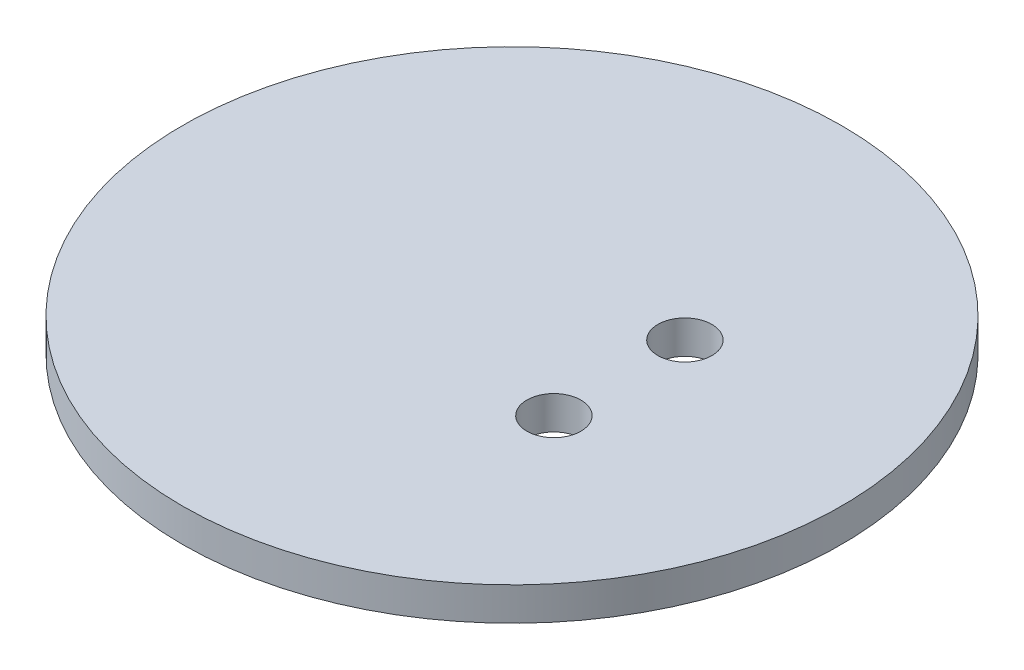
ISO-10303-21;
HEADER;
FILE_DESCRIPTION(('STEP AP214'),'2;1');
FILE_NAME('part.step','',(''),(''),'','','');
FILE_SCHEMA(('AUTOMOTIVE_DESIGN { 1 0 10303 214 1 1 1 1 }'));
ENDSEC;
DATA;
#1=APPLICATION_CONTEXT('core data for automotive mechanical design processes');
#2=APPLICATION_PROTOCOL_DEFINITION('international standard','automotive_design',2000,#1);
#3=PRODUCT_CONTEXT('',#1,'mechanical');
#4=PRODUCT('Part','Part','',(#3));
#5=PRODUCT_RELATED_PRODUCT_CATEGORY('part','',(#4));
#6=PRODUCT_DEFINITION_FORMATION('','',#4);
#7=PRODUCT_DEFINITION_CONTEXT('part definition',#1,'design');
#8=PRODUCT_DEFINITION('design','',#6,#7);
#9=PRODUCT_DEFINITION_SHAPE('','',#8);
#10=(LENGTH_UNIT() NAMED_UNIT(*) SI_UNIT(.MILLI.,.METRE.));
#11=(NAMED_UNIT(*) PLANE_ANGLE_UNIT() SI_UNIT($,.RADIAN.));
#12=(NAMED_UNIT(*) SI_UNIT($,.STERADIAN.) SOLID_ANGLE_UNIT());
#13=UNCERTAINTY_MEASURE_WITH_UNIT(LENGTH_MEASURE(1.E-05),#10,'distance_accuracy_value','');
#14=(GEOMETRIC_REPRESENTATION_CONTEXT(3) GLOBAL_UNCERTAINTY_ASSIGNED_CONTEXT((#13)) GLOBAL_UNIT_ASSIGNED_CONTEXT((#10,
#11,#12)) REPRESENTATION_CONTEXT('',''));
#15=CARTESIAN_POINT('',(0.,0.,0.));
#16=DIRECTION('',(0.,0.,1.));
#17=DIRECTION('',(1.,0.,0.));
#18=AXIS2_PLACEMENT_3D('',#15,#16,#17);
#19=CARTESIAN_POINT('',(0.,0.8,0.));
#20=DIRECTION('',(0.,-1.,0.));
#21=DIRECTION('',(0.,0.,-1.));
#22=AXIS2_PLACEMENT_3D('',#19,#20,#21);
#23=CYLINDRICAL_SURFACE('',#22,7.925);
#24=CARTESIAN_POINT('',(0.,0.8,0.));
#25=DIRECTION('',(0.,1.,0.));
#26=DIRECTION('',(0.,0.,1.));
#27=AXIS2_PLACEMENT_3D('',#24,#25,#26);
#28=CIRCLE('',#27,7.925);
#29=CARTESIAN_POINT('',(0.,0.8,7.925));
#30=VERTEX_POINT('',#29);
#31=EDGE_CURVE('E10',#30,#30,#28,.T.);
#32=ORIENTED_EDGE('',*,*,#31,.F.);
#33=EDGE_LOOP('',(#32));
#34=FACE_BOUND('',#33,.T.);
#35=CARTESIAN_POINT('',(0.,0.,0.));
#36=DIRECTION('',(0.,1.,0.));
#37=DIRECTION('',(0.,0.,1.));
#38=AXIS2_PLACEMENT_3D('',#35,#36,#37);
#39=CIRCLE('',#38,7.925);
#40=CARTESIAN_POINT('',(0.,0.,7.925));
#41=VERTEX_POINT('',#40);
#42=EDGE_CURVE('E39',#41,#41,#39,.T.);
#43=ORIENTED_EDGE('',*,*,#42,.T.);
#44=EDGE_LOOP('',(#43));
#45=FACE_BOUND('',#44,.T.);
#46=ADVANCED_FACE('F32',(#34,#45),#23,.T.);
#47=CARTESIAN_POINT('',(0.,0.8,0.));
#48=DIRECTION('',(0.,1.,0.));
#49=DIRECTION('',(0.,0.,1.));
#50=AXIS2_PLACEMENT_3D('',#47,#48,#49);
#51=PLANE('',#50);
#52=CARTESIAN_POINT('',(2.58263431402899,0.8,-1.575));
#53=DIRECTION('',(0.,1.,0.));
#54=DIRECTION('',(0.,0.,1.));
#55=AXIS2_PLACEMENT_3D('',#52,#53,#54);
#56=CIRCLE('',#55,0.65);
#57=CARTESIAN_POINT('',(2.58263431402899,0.8,-0.925));
#58=VERTEX_POINT('',#57);
#59=EDGE_CURVE('E50',#58,#58,#56,.T.);
#60=ORIENTED_EDGE('',*,*,#59,.F.);
#61=EDGE_LOOP('',(#60));
#62=FACE_BOUND('',#61,.T.);
#63=CARTESIAN_POINT('',(2.58263431402899,0.8,1.575));
#64=DIRECTION('',(0.,1.,0.));
#65=DIRECTION('',(0.,0.,1.));
#66=AXIS2_PLACEMENT_3D('',#63,#64,#65);
#67=CIRCLE('',#66,0.65);
#68=CARTESIAN_POINT('',(2.58263431402899,0.8,2.225));
#69=VERTEX_POINT('',#68);
#70=EDGE_CURVE('E46',#69,#69,#67,.T.);
#71=ORIENTED_EDGE('',*,*,#70,.F.);
#72=EDGE_LOOP('',(#71));
#73=FACE_BOUND('',#72,.T.);
#74=ORIENTED_EDGE('',*,*,#31,.T.);
#75=EDGE_LOOP('',(#74));
#76=FACE_BOUND('',#75,.T.);
#77=ADVANCED_FACE('F63',(#62,#73,#76),#51,.T.);
#78=CARTESIAN_POINT('',(0.,0.,0.));
#79=DIRECTION('',(0.,1.,0.));
#80=DIRECTION('',(0.,0.,1.));
#81=AXIS2_PLACEMENT_3D('',#78,#79,#80);
#82=PLANE('',#81);
#83=CARTESIAN_POINT('',(2.58263431402899,0.,-1.575));
#84=DIRECTION('',(0.,1.,0.));
#85=DIRECTION('',(0.,0.,1.));
#86=AXIS2_PLACEMENT_3D('',#83,#84,#85);
#87=CIRCLE('',#86,0.65);
#88=CARTESIAN_POINT('',(2.58263431402899,0.,-0.925));
#89=VERTEX_POINT('',#88);
#90=EDGE_CURVE('E35',#89,#89,#87,.T.);
#91=ORIENTED_EDGE('',*,*,#90,.T.);
#92=EDGE_LOOP('',(#91));
#93=FACE_BOUND('',#92,.T.);
#94=CARTESIAN_POINT('',(2.58263431402899,0.,1.575));
#95=DIRECTION('',(0.,1.,0.));
#96=DIRECTION('',(0.,0.,1.));
#97=AXIS2_PLACEMENT_3D('',#94,#95,#96);
#98=CIRCLE('',#97,0.65);
#99=CARTESIAN_POINT('',(2.58263431402899,0.,2.225));
#100=VERTEX_POINT('',#99);
#101=EDGE_CURVE('E48',#100,#100,#98,.T.);
#102=ORIENTED_EDGE('',*,*,#101,.T.);
#103=EDGE_LOOP('',(#102));
#104=FACE_BOUND('',#103,.T.);
#105=ORIENTED_EDGE('',*,*,#42,.F.);
#106=EDGE_LOOP('',(#105));
#107=FACE_BOUND('',#106,.T.);
#108=ADVANCED_FACE('F65',(#93,#104,#107),#82,.F.);
#109=CARTESIAN_POINT('',(2.58263431402899,-0.0999999999999999,1.575));
#110=DIRECTION('',(0.,1.,0.));
#111=DIRECTION('',(0.,0.,1.));
#112=AXIS2_PLACEMENT_3D('',#109,#110,#111);
#113=CYLINDRICAL_SURFACE('',#112,0.65);
#114=ORIENTED_EDGE('',*,*,#70,.T.);
#115=EDGE_LOOP('',(#114));
#116=FACE_BOUND('',#115,.T.);
#117=ORIENTED_EDGE('',*,*,#101,.F.);
#118=EDGE_LOOP('',(#117));
#119=FACE_BOUND('',#118,.T.);
#120=ADVANCED_FACE('F60',(#116,#119),#113,.F.);
#121=CARTESIAN_POINT('',(2.58263431402899,-0.0999999999999999,-1.575));
#122=DIRECTION('',(0.,1.,0.));
#123=DIRECTION('',(0.,0.,1.));
#124=AXIS2_PLACEMENT_3D('',#121,#122,#123);
#125=CYLINDRICAL_SURFACE('',#124,0.65);
#126=ORIENTED_EDGE('',*,*,#59,.T.);
#127=EDGE_LOOP('',(#126));
#128=FACE_BOUND('',#127,.T.);
#129=ORIENTED_EDGE('',*,*,#90,.F.);
#130=EDGE_LOOP('',(#129));
#131=FACE_BOUND('',#130,.T.);
#132=ADVANCED_FACE('F77',(#128,#131),#125,.F.);
#133=CLOSED_SHELL('',(#46,#77,#108,#120,#132));
#134=MANIFOLD_SOLID_BREP('B2',#133);
#135=ADVANCED_BREP_SHAPE_REPRESENTATION('',(#18,#134),#14);
#136=SHAPE_DEFINITION_REPRESENTATION(#9,#135);
ENDSEC;
END-ISO-10303-21;
